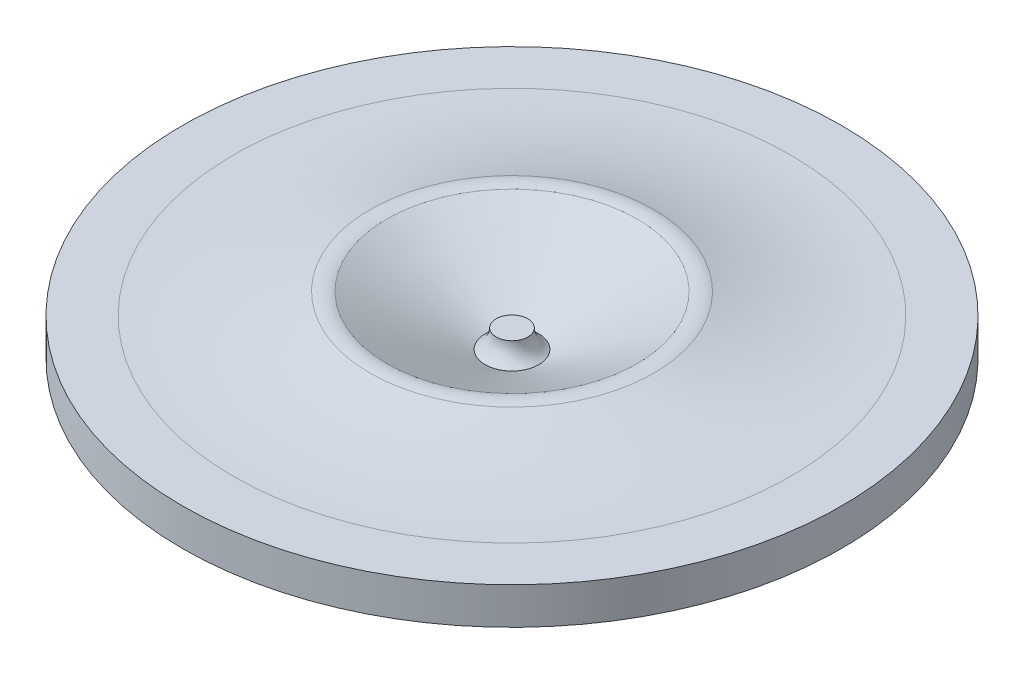
ISO-10303-21;
HEADER;
FILE_DESCRIPTION(('STEP AP214'),'2;1');
FILE_NAME('part.step','',(''),(''),'','','');
FILE_SCHEMA(('AUTOMOTIVE_DESIGN { 1 0 10303 214 1 1 1 1 }'));
ENDSEC;
DATA;
#1=APPLICATION_CONTEXT('core data for automotive mechanical design processes');
#2=APPLICATION_PROTOCOL_DEFINITION('international standard','automotive_design',2000,#1);
#3=PRODUCT_CONTEXT('',#1,'mechanical');
#4=PRODUCT('Part','Part','',(#3));
#5=PRODUCT_RELATED_PRODUCT_CATEGORY('part','',(#4));
#6=PRODUCT_DEFINITION_FORMATION('','',#4);
#7=PRODUCT_DEFINITION_CONTEXT('part definition',#1,'design');
#8=PRODUCT_DEFINITION('design','',#6,#7);
#9=PRODUCT_DEFINITION_SHAPE('','',#8);
#10=(LENGTH_UNIT() NAMED_UNIT(*) SI_UNIT(.MILLI.,.METRE.));
#11=(NAMED_UNIT(*) PLANE_ANGLE_UNIT() SI_UNIT($,.RADIAN.));
#12=(NAMED_UNIT(*) SI_UNIT($,.STERADIAN.) SOLID_ANGLE_UNIT());
#13=UNCERTAINTY_MEASURE_WITH_UNIT(LENGTH_MEASURE(1.E-05),#10,'distance_accuracy_value','');
#14=(GEOMETRIC_REPRESENTATION_CONTEXT(3) GLOBAL_UNCERTAINTY_ASSIGNED_CONTEXT((#13)) GLOBAL_UNIT_ASSIGNED_CONTEXT((#10,
#11,#12)) REPRESENTATION_CONTEXT('',''));
#15=CARTESIAN_POINT('',(0.,0.,0.));
#16=DIRECTION('',(0.,0.,1.));
#17=DIRECTION('',(1.,0.,0.));
#18=AXIS2_PLACEMENT_3D('',#15,#16,#17);
#19=CARTESIAN_POINT('',(-22.2367374445298,6.4826415305111,1.3837808827476));
#20=DIRECTION('',(0.,-1.,0.));
#21=DIRECTION('',(0.,0.,-1.));
#22=AXIS2_PLACEMENT_3D('',#19,#20,#21);
#23=PLANE('',#22);
#24=CARTESIAN_POINT('',(-22.2367374445298,6.48264153051111,1.3837808827476));
#25=DIRECTION('',(0.,-1.,0.));
#26=DIRECTION('',(0.,0.,-1.));
#27=AXIS2_PLACEMENT_3D('',#24,#25,#26);
#28=CIRCLE('',#27,125.);
#29=CARTESIAN_POINT('',(-22.2367374445298,6.48264153051111,-123.616219117252));
#30=VERTEX_POINT('',#29);
#31=EDGE_CURVE('E10',#30,#30,#28,.T.);
#32=ORIENTED_EDGE('',*,*,#31,.T.);
#33=EDGE_LOOP('',(#32));
#34=FACE_BOUND('',#33,.T.);
#35=ADVANCED_FACE('F39',(#34),#23,.T.);
#36=CARTESIAN_POINT('',(-22.2367374445298,6.4826415305111,1.3837808827476));
#37=DIRECTION('',(0.,-1.,0.));
#38=DIRECTION('',(0.,0.,-1.));
#39=AXIS2_PLACEMENT_3D('',#36,#37,#38);
#40=CYLINDRICAL_SURFACE('',#39,125.);
#41=CARTESIAN_POINT('',(-22.2367374445298,20.4826415305111,1.3837808827476));
#42=DIRECTION('',(0.,-1.,0.));
#43=DIRECTION('',(0.,0.,-1.));
#44=AXIS2_PLACEMENT_3D('',#41,#42,#43);
#45=CIRCLE('',#44,125.);
#46=CARTESIAN_POINT('',(-22.2367374445298,20.4826415305111,-123.616219117252));
#47=VERTEX_POINT('',#46);
#48=EDGE_CURVE('E45',#47,#47,#45,.T.);
#49=ORIENTED_EDGE('',*,*,#48,.T.);
#50=EDGE_LOOP('',(#49));
#51=FACE_BOUND('',#50,.T.);
#52=ORIENTED_EDGE('',*,*,#31,.F.);
#53=EDGE_LOOP('',(#52));
#54=FACE_BOUND('',#53,.T.);
#55=ADVANCED_FACE('F80',(#51,#54),#40,.T.);
#56=CARTESIAN_POINT('',(83.3882625554702,20.4826415305111,1.3837808827476));
#57=DIRECTION('',(0.,-1.,0.));
#58=DIRECTION('',(0.,0.,-1.));
#59=AXIS2_PLACEMENT_3D('',#56,#57,#58);
#60=PLANE('',#59);
#61=ORIENTED_EDGE('',*,*,#48,.F.);
#62=EDGE_LOOP('',(#61));
#63=FACE_BOUND('',#62,.T.);
#64=CARTESIAN_POINT('',(-22.2367374445298,20.4826415305111,1.3837808827476));
#65=DIRECTION('',(0.,-1.,0.));
#66=DIRECTION('',(0.,0.,-1.));
#67=AXIS2_PLACEMENT_3D('',#64,#65,#66);
#68=CIRCLE('',#67,105.625);
#69=CARTESIAN_POINT('',(-22.2367374445298,20.4826415305111,-104.241219117252));
#70=VERTEX_POINT('',#69);
#71=EDGE_CURVE('E49',#70,#70,#68,.T.);
#72=ORIENTED_EDGE('',*,*,#71,.T.);
#73=EDGE_LOOP('',(#72));
#74=FACE_BOUND('',#73,.T.);
#75=ADVANCED_FACE('F84',(#63,#74),#60,.F.);
#76=CARTESIAN_POINT('',(-22.2367374445298,192.408422780509,1.3837808827476));
#77=DIRECTION('',(0.,-1.,0.));
#78=DIRECTION('',(0.,0.,-1.));
#79=AXIS2_PLACEMENT_3D('',#76,#77,#78);
#80=DEGENERATE_TOROIDAL_SURFACE('',#79,105.625,171.925781249998,.T.);
#81=ORIENTED_EDGE('',*,*,#71,.F.);
#82=EDGE_LOOP('',(#81));
#83=FACE_BOUND('',#82,.T.);
#84=CARTESIAN_POINT('',(-22.2367374445298,28.4826415305112,1.3837808827476));
#85=DIRECTION('',(0.,-1.,0.));
#86=DIRECTION('',(0.,0.,-1.));
#87=AXIS2_PLACEMENT_3D('',#84,#85,#86);
#88=CIRCLE('',#87,53.790527879605);
#89=CARTESIAN_POINT('',(-22.2367374445298,28.4826415305112,-52.4067469968574));
#90=VERTEX_POINT('',#89);
#91=EDGE_CURVE('E53',#90,#90,#88,.T.);
#92=ORIENTED_EDGE('',*,*,#91,.T.);
#93=EDGE_LOOP('',(#92));
#94=FACE_BOUND('',#93,.T.);
#95=ADVANCED_FACE('F88',(#83,#94),#80,.F.);
#96=CARTESIAN_POINT('',(-22.2367374445298,18.5357890310394,1.3837808827476));
#97=DIRECTION('',(0.,-1.,0.));
#98=DIRECTION('',(0.,0.,-1.));
#99=AXIS2_PLACEMENT_3D('',#96,#97,#98);
#100=TOROIDAL_SURFACE('',#99,50.6452639398027,10.4322845003991);
#101=CARTESIAN_POINT('',(-22.2367374445298,28.4826415305111,1.3837808827476));
#102=DIRECTION('',(0.,-1.,0.));
#103=DIRECTION('',(0.,0.,-1.));
#104=AXIS2_PLACEMENT_3D('',#101,#102,#103);
#105=CIRCLE('',#104,47.5);
#106=CARTESIAN_POINT('',(-22.2367374445298,28.4826415305111,48.8837808827476));
#107=VERTEX_POINT('',#106);
#108=EDGE_CURVE('E58',#107,#107,#105,.T.);
#109=ORIENTED_EDGE('',*,*,#108,.T.);
#110=EDGE_LOOP('',(#109));
#111=FACE_BOUND('',#110,.T.);
#112=ORIENTED_EDGE('',*,*,#91,.F.);
#113=EDGE_LOOP('',(#112));
#114=FACE_BOUND('',#113,.T.);
#115=ADVANCED_FACE('F95',(#111,#114),#100,.T.);
#116=CARTESIAN_POINT('',(-22.2367374445298,9.46605034325959,1.3837808827476));
#117=DIRECTION('',(0.,1.,0.));
#118=DIRECTION('',(0.,0.,1.));
#119=AXIS2_PLACEMENT_3D('',#116,#117,#118);
#120=CONICAL_SURFACE('',#119,10.1571562468682,1.09978148893551);
#121=CARTESIAN_POINT('',(-22.2367374445298,9.46605034325959,1.3837808827476));
#122=DIRECTION('',(0.,-1.,0.));
#123=DIRECTION('',(0.,0.,-1.));
#124=AXIS2_PLACEMENT_3D('',#121,#122,#123);
#125=CIRCLE('',#124,10.1571562468682);
#126=CARTESIAN_POINT('',(-22.2367374445298,9.46605034325959,11.5409371296158));
#127=VERTEX_POINT('',#126);
#128=EDGE_CURVE('E61',#127,#127,#125,.T.);
#129=CARTESIAN_POINT('',(-22.2367374445298,28.4826415305111,48.8837808827476));
#130=CARTESIAN_POINT('',(-22.2367374445298,28.2845520389772,48.4947929269858));
#131=CARTESIAN_POINT('',(-22.2367374445298,28.0864625474433,48.105804971224));
#132=CARTESIAN_POINT('',(-22.2367374445298,27.6902835643756,47.3278290597004));
#133=CARTESIAN_POINT('',(-22.2367374445298,27.4921940728417,46.9388411039386));
#134=CARTESIAN_POINT('',(-22.2367374445298,27.096015089774,46.1608651924151));
#135=CARTESIAN_POINT('',(-22.2367374445298,26.8979255982401,45.7718772366533));
#136=CARTESIAN_POINT('',(-22.2367374445298,26.5017466151724,44.9939013251297));
#137=CARTESIAN_POINT('',(-22.2367374445298,26.3036571236385,44.6049133693679));
#138=CARTESIAN_POINT('',(-22.2367374445298,25.9074781405708,43.8269374578443));
#139=CARTESIAN_POINT('',(-22.2367374445298,25.7093886490369,43.4379495020825));
#140=CARTESIAN_POINT('',(-22.2367374445298,25.3132096659692,42.659973590559));
#141=CARTESIAN_POINT('',(-22.2367374445298,25.1151201744353,42.2709856347972));
#142=CARTESIAN_POINT('',(-22.2367374445298,24.7189411913675,41.4930097232736));
#143=CARTESIAN_POINT('',(-22.2367374445298,24.5208516998337,41.1040217675118));
#144=CARTESIAN_POINT('',(-22.2367374445298,24.1246727167659,40.3260458559882));
#145=CARTESIAN_POINT('',(-22.2367374445298,23.9265832252321,39.9370579002264));
#146=CARTESIAN_POINT('',(-22.2367374445298,23.5304042421643,39.1590819887028));
#147=CARTESIAN_POINT('',(-22.2367374445298,23.3323147506305,38.7700940329411));
#148=CARTESIAN_POINT('',(-22.2367374445298,22.9361357675627,37.9921181214175));
#149=CARTESIAN_POINT('',(-22.2367374445298,22.7380462760289,37.6031301656557));
#150=CARTESIAN_POINT('',(-22.2367374445298,22.3418672929611,36.8251542541321));
#151=CARTESIAN_POINT('',(-22.2367374445298,22.1437778014272,36.4361662983703));
#152=CARTESIAN_POINT('',(-22.2367374445298,21.7475988183595,35.6581903868467));
#153=CARTESIAN_POINT('',(-22.2367374445298,21.5495093268256,35.2692024310849));
#154=CARTESIAN_POINT('',(-22.2367374445298,21.1533303437579,34.4912265195614));
#155=CARTESIAN_POINT('',(-22.2367374445298,20.955240852224,34.1022385637996));
#156=CARTESIAN_POINT('',(-22.2367374445298,20.5590618691563,33.324262652276));
#157=CARTESIAN_POINT('',(-22.2367374445298,20.3609723776224,32.9352746965142));
#158=CARTESIAN_POINT('',(-22.2367374445298,19.9647933945547,32.1572987849906));
#159=CARTESIAN_POINT('',(-22.2367374445298,19.7667039030208,31.7683108292288));
#160=CARTESIAN_POINT('',(-22.2367374445298,19.3705249199531,30.9903349177053));
#161=CARTESIAN_POINT('',(-22.2367374445298,19.1724354284192,30.6013469619435));
#162=CARTESIAN_POINT('',(-22.2367374445298,18.7762564453515,29.8233710504199));
#163=CARTESIAN_POINT('',(-22.2367374445298,18.5781669538176,29.4343830946581));
#164=CARTESIAN_POINT('',(-22.2367374445298,18.1819879707498,28.6564071831345));
#165=CARTESIAN_POINT('',(-22.2367374445298,17.983898479216,28.2674192273727));
#166=CARTESIAN_POINT('',(-22.2367374445298,17.5877194961482,27.4894433158491));
#167=CARTESIAN_POINT('',(-22.2367374445298,17.3896300046144,27.1004553600874));
#168=CARTESIAN_POINT('',(-22.2367374445298,16.9934510215466,26.3224794485638));
#169=CARTESIAN_POINT('',(-22.2367374445298,16.7953615300128,25.933491492802));
#170=CARTESIAN_POINT('',(-22.2367374445298,16.399182546945,25.1555155812784));
#171=CARTESIAN_POINT('',(-22.2367374445298,16.2010930554112,24.7665276255166));
#172=CARTESIAN_POINT('',(-22.2367374445298,15.8049140723434,23.988551713993));
#173=CARTESIAN_POINT('',(-22.2367374445298,15.6068245808095,23.5995637582312));
#174=CARTESIAN_POINT('',(-22.2367374445298,15.2106455977418,22.8215878467077));
#175=CARTESIAN_POINT('',(-22.2367374445298,15.0125561062079,22.4325998909459));
#176=CARTESIAN_POINT('',(-22.2367374445298,14.6163771231402,21.6546239794223));
#177=CARTESIAN_POINT('',(-22.2367374445298,14.4182876316063,21.2656360236605));
#178=CARTESIAN_POINT('',(-22.2367374445298,14.0221086485386,20.4876601121369));
#179=CARTESIAN_POINT('',(-22.2367374445298,13.8240191570047,20.0986721563751));
#180=CARTESIAN_POINT('',(-22.2367374445298,13.427840173937,19.3206962448516));
#181=CARTESIAN_POINT('',(-22.2367374445298,13.2297506824031,18.9317082890898));
#182=CARTESIAN_POINT('',(-22.2367374445298,12.8335716993354,18.1537323775662));
#183=CARTESIAN_POINT('',(-22.2367374445298,12.6354822078015,17.7647444218044));
#184=CARTESIAN_POINT('',(-22.2367374445298,12.2393032247338,16.9867685102808));
#185=CARTESIAN_POINT('',(-22.2367374445298,12.0412137331999,16.597780554519));
#186=CARTESIAN_POINT('',(-22.2367374445298,11.6450347501322,15.8198046429954));
#187=CARTESIAN_POINT('',(-22.2367374445298,11.4469452585983,15.4308166872337));
#188=CARTESIAN_POINT('',(-22.2367374445298,11.0507662755306,14.6528407757101));
#189=CARTESIAN_POINT('',(-22.2367374445298,10.8526767839967,14.2638528199483));
#190=CARTESIAN_POINT('',(-22.2367374445298,10.4564978009289,13.4858769084247));
#191=CARTESIAN_POINT('',(-22.2367374445298,10.2584083093951,13.0968889526629));
#192=CARTESIAN_POINT('',(-22.2367374445298,9.86222932632734,12.3189130411393));
#193=CARTESIAN_POINT('',(-22.2367374445298,9.66413983479346,11.9299250853775));
#194=CARTESIAN_POINT('',(-22.2367374445298,9.46605034325959,11.5409371296158));
#195=B_SPLINE_CURVE_WITH_KNOTS('',3,(#129,#130,#131,#132,#133,#134,#135,#136,#137,#138,#139,
#140,#141,#142,#143,#144,#145,#146,#147,#148,#149,#150,#151,#152,#153,#154,#155,#156,#157,#158,
#159,#160,#161,#162,#163,#164,#165,#166,#167,#168,#169,#170,#171,#172,#173,#174,#175,#176,#177,
#178,#179,#180,#181,#182,#183,#184,#185,#186,#187,#188,#189,#190,#191,#192,#193,#194),
.UNSPECIFIED.,.F.,.F.,(4,2,2,2,2,2,2,2,2,2,2,2,2,2,2,2,2,2,2,2,2,2,2,2,2,2,2,2,2,2,2,2,4),(0.,
1.30956469387922,2.61912938775842,3.92869408163763,5.23825877551685,6.54782346939605,
7.85738816327526,9.16695285715448,10.4765175510337,11.7860822449129,13.0956469387921,
14.4052116326713,15.7147763265505,17.0243410204297,18.333905714309,19.6434704081882,
20.9530351020674,22.2625997959466,23.5721644898258,24.881729183705,26.1912938775842,
27.5008585714634,28.8104232653426,30.1199879592218,31.4295526531011,32.7391173469803,
34.0486820408595,35.3582467347387,36.6678114286179,37.9773761224971,39.2869408163763,
40.5965055102555,41.9060702041347),.UNSPECIFIED.);
#196=EDGE_CURVE('BSEAM76',#107,#127,#195,.T.);
#197=ORIENTED_EDGE('',*,*,#108,.F.);
#198=ORIENTED_EDGE('',*,*,#128,.T.);
#199=ORIENTED_EDGE('',*,*,#196,.T.);
#200=ORIENTED_EDGE('',*,*,#196,.F.);
#201=EDGE_LOOP('',(#197,#199,#198,#200));
#202=FACE_BOUND('',#201,.T.);
#203=ADVANCED_FACE('F76',(#202),#120,.F.);
#204=CARTESIAN_POINT('',(-22.2367374445298,16.4826415305112,1.3837808827476));
#205=DIRECTION('',(0.,-1.,0.));
#206=DIRECTION('',(0.,0.,-1.));
#207=AXIS2_PLACEMENT_3D('',#204,#205,#206);
#208=TOROIDAL_SURFACE('',#207,14.0000000000001,8.00000000000008);
#209=ORIENTED_EDGE('',*,*,#128,.F.);
#210=EDGE_LOOP('',(#209));
#211=FACE_BOUND('',#210,.T.);
#212=CARTESIAN_POINT('',(-22.2367374445298,16.4826415305111,1.3837808827476));
#213=DIRECTION('',(0.,-1.,0.));
#214=DIRECTION('',(0.,0.,-1.));
#215=AXIS2_PLACEMENT_3D('',#212,#213,#214);
#216=CIRCLE('',#215,6.);
#217=CARTESIAN_POINT('',(-22.2367374445298,16.4826415305111,-4.6162191172524));
#218=VERTEX_POINT('',#217);
#219=EDGE_CURVE('E64',#218,#218,#216,.T.);
#220=ORIENTED_EDGE('',*,*,#219,.T.);
#221=EDGE_LOOP('',(#220));
#222=FACE_BOUND('',#221,.T.);
#223=ADVANCED_FACE('F68',(#211,#222),#208,.F.);
#224=CARTESIAN_POINT('',(-22.2367374445298,16.4826415305111,1.3837808827476));
#225=DIRECTION('',(0.,-1.,0.));
#226=DIRECTION('',(0.,0.,-1.));
#227=AXIS2_PLACEMENT_3D('',#224,#225,#226);
#228=PLANE('',#227);
#229=ORIENTED_EDGE('',*,*,#219,.F.);
#230=EDGE_LOOP('',(#229));
#231=FACE_BOUND('',#230,.T.);
#232=ADVANCED_FACE('F70',(#231),#228,.F.);
#233=CLOSED_SHELL('',(#35,#55,#75,#95,#115,#203,#223,#232));
#234=MANIFOLD_SOLID_BREP('B2',#233);
#235=ADVANCED_BREP_SHAPE_REPRESENTATION('',(#18,#234),#14);
#236=SHAPE_DEFINITION_REPRESENTATION(#9,#235);
ENDSEC;
END-ISO-10303-21;
